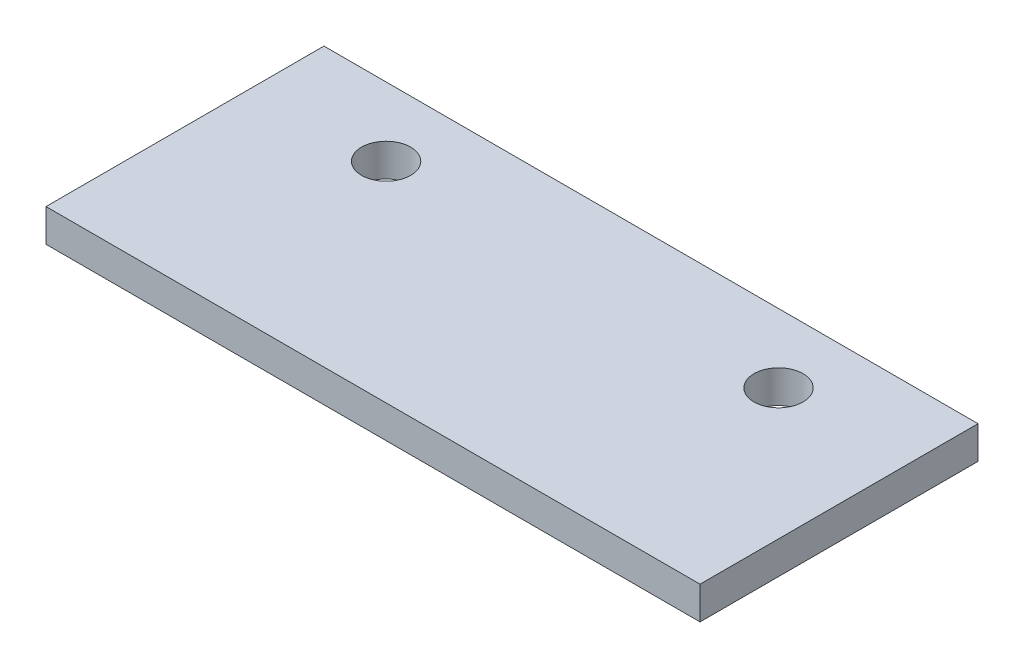
ISO-10303-21;
HEADER;
FILE_DESCRIPTION(('STEP AP214'),'2;1');
FILE_NAME('part.step','',(''),(''),'','','');
FILE_SCHEMA(('AUTOMOTIVE_DESIGN { 1 0 10303 214 1 1 1 1 }'));
ENDSEC;
DATA;
#1=APPLICATION_CONTEXT('core data for automotive mechanical design processes');
#2=APPLICATION_PROTOCOL_DEFINITION('international standard','automotive_design',2000,#1);
#3=PRODUCT_CONTEXT('',#1,'mechanical');
#4=PRODUCT('Part','Part','',(#3));
#5=PRODUCT_RELATED_PRODUCT_CATEGORY('part','',(#4));
#6=PRODUCT_DEFINITION_FORMATION('','',#4);
#7=PRODUCT_DEFINITION_CONTEXT('part definition',#1,'design');
#8=PRODUCT_DEFINITION('design','',#6,#7);
#9=PRODUCT_DEFINITION_SHAPE('','',#8);
#10=(LENGTH_UNIT() NAMED_UNIT(*) SI_UNIT(.MILLI.,.METRE.));
#11=(NAMED_UNIT(*) PLANE_ANGLE_UNIT() SI_UNIT($,.RADIAN.));
#12=(NAMED_UNIT(*) SI_UNIT($,.STERADIAN.) SOLID_ANGLE_UNIT());
#13=UNCERTAINTY_MEASURE_WITH_UNIT(LENGTH_MEASURE(1.E-05),#10,'distance_accuracy_value','');
#14=(GEOMETRIC_REPRESENTATION_CONTEXT(3) GLOBAL_UNCERTAINTY_ASSIGNED_CONTEXT((#13)) GLOBAL_UNIT_ASSIGNED_CONTEXT((#10,
#11,#12)) REPRESENTATION_CONTEXT('',''));
#15=CARTESIAN_POINT('',(0.,0.,0.));
#16=DIRECTION('',(0.,0.,1.));
#17=DIRECTION('',(1.,0.,0.));
#18=AXIS2_PLACEMENT_3D('',#15,#16,#17);
#19=CARTESIAN_POINT('',(-100.,10.,42.5));
#20=DIRECTION('',(1.,0.,0.));
#21=DIRECTION('',(0.,0.,-1.));
#22=AXIS2_PLACEMENT_3D('',#19,#20,#21);
#23=PLANE('',#22);
#24=DIRECTION('',(0.,0.,1.));
#25=VECTOR('',#24,1.);
#26=CARTESIAN_POINT('',(-100.,0.,42.5));
#27=LINE('',#26,#25);
#28=CARTESIAN_POINT('',(-100.,0.,-42.5));
#29=VERTEX_POINT('',#28);
#30=CARTESIAN_POINT('',(-100.,0.,42.5));
#31=VERTEX_POINT('',#30);
#32=EDGE_CURVE('E98',#29,#31,#27,.T.);
#33=ORIENTED_EDGE('',*,*,#32,.T.);
#34=DIRECTION('',(0.,-1.,0.));
#35=VECTOR('',#34,1.);
#36=CARTESIAN_POINT('',(-100.,10.,42.5));
#37=LINE('',#36,#35);
#38=CARTESIAN_POINT('',(-100.,10.,42.5));
#39=VERTEX_POINT('',#38);
#40=EDGE_CURVE('E11',#39,#31,#37,.T.);
#41=ORIENTED_EDGE('',*,*,#40,.F.);
#42=DIRECTION('',(0.,0.,1.));
#43=VECTOR('',#42,1.);
#44=CARTESIAN_POINT('',(-100.,10.,42.5));
#45=LINE('',#44,#43);
#46=CARTESIAN_POINT('',(-100.,10.,-42.5));
#47=VERTEX_POINT('',#46);
#48=EDGE_CURVE('E86',#47,#39,#45,.T.);
#49=ORIENTED_EDGE('',*,*,#48,.F.);
#50=DIRECTION('',(0.,-1.,0.));
#51=VECTOR('',#50,1.);
#52=CARTESIAN_POINT('',(-100.,10.,-42.5));
#53=LINE('',#52,#51);
#54=EDGE_CURVE('E94',#47,#29,#53,.T.);
#55=ORIENTED_EDGE('',*,*,#54,.T.);
#56=EDGE_LOOP('',(#33,#41,#49,#55));
#57=FACE_BOUND('',#56,.T.);
#58=ADVANCED_FACE('F35',(#57),#23,.F.);
#59=CARTESIAN_POINT('',(100.,10.,42.5));
#60=DIRECTION('',(0.,0.,-1.));
#61=DIRECTION('',(-1.,0.,0.));
#62=AXIS2_PLACEMENT_3D('',#59,#60,#61);
#63=PLANE('',#62);
#64=DIRECTION('',(1.,0.,0.));
#65=VECTOR('',#64,1.);
#66=CARTESIAN_POINT('',(100.,0.,42.5));
#67=LINE('',#66,#65);
#68=CARTESIAN_POINT('',(100.,0.,42.5));
#69=VERTEX_POINT('',#68);
#70=EDGE_CURVE('E90',#31,#69,#67,.T.);
#71=ORIENTED_EDGE('',*,*,#70,.T.);
#72=DIRECTION('',(0.,-1.,0.));
#73=VECTOR('',#72,1.);
#74=CARTESIAN_POINT('',(100.,10.,42.5));
#75=LINE('',#74,#73);
#76=CARTESIAN_POINT('',(100.,10.,42.5));
#77=VERTEX_POINT('',#76);
#78=EDGE_CURVE('E43',#77,#69,#75,.T.);
#79=ORIENTED_EDGE('',*,*,#78,.F.);
#80=DIRECTION('',(1.,0.,0.));
#81=VECTOR('',#80,1.);
#82=CARTESIAN_POINT('',(100.,10.,42.5));
#83=LINE('',#82,#81);
#84=EDGE_CURVE('E81',#39,#77,#83,.T.);
#85=ORIENTED_EDGE('',*,*,#84,.F.);
#86=ORIENTED_EDGE('',*,*,#40,.T.);
#87=EDGE_LOOP('',(#71,#79,#85,#86));
#88=FACE_BOUND('',#87,.T.);
#89=ADVANCED_FACE('F89',(#88),#63,.F.);
#90=CARTESIAN_POINT('',(100.,10.,42.5));
#91=DIRECTION('',(-1.,0.,0.));
#92=DIRECTION('',(0.,0.,1.));
#93=AXIS2_PLACEMENT_3D('',#90,#91,#92);
#94=PLANE('',#93);
#95=DIRECTION('',(0.,0.,-1.));
#96=VECTOR('',#95,1.);
#97=CARTESIAN_POINT('',(100.,0.,42.5));
#98=LINE('',#97,#96);
#99=CARTESIAN_POINT('',(100.,0.,-42.5));
#100=VERTEX_POINT('',#99);
#101=EDGE_CURVE('E68',#69,#100,#98,.T.);
#102=ORIENTED_EDGE('',*,*,#101,.T.);
#103=DIRECTION('',(0.,-1.,0.));
#104=VECTOR('',#103,1.);
#105=CARTESIAN_POINT('',(100.,10.,-42.5));
#106=LINE('',#105,#104);
#107=CARTESIAN_POINT('',(100.,10.,-42.5));
#108=VERTEX_POINT('',#107);
#109=EDGE_CURVE('E91',#108,#100,#106,.T.);
#110=ORIENTED_EDGE('',*,*,#109,.F.);
#111=DIRECTION('',(0.,0.,-1.));
#112=VECTOR('',#111,1.);
#113=CARTESIAN_POINT('',(100.,10.,42.5));
#114=LINE('',#113,#112);
#115=EDGE_CURVE('E84',#77,#108,#114,.T.);
#116=ORIENTED_EDGE('',*,*,#115,.F.);
#117=ORIENTED_EDGE('',*,*,#78,.T.);
#118=EDGE_LOOP('',(#102,#110,#116,#117));
#119=FACE_BOUND('',#118,.T.);
#120=ADVANCED_FACE('F92',(#119),#94,.F.);
#121=CARTESIAN_POINT('',(100.,10.,-42.5));
#122=DIRECTION('',(0.,0.,1.));
#123=DIRECTION('',(1.,0.,0.));
#124=AXIS2_PLACEMENT_3D('',#121,#122,#123);
#125=PLANE('',#124);
#126=DIRECTION('',(-1.,0.,0.));
#127=VECTOR('',#126,1.);
#128=CARTESIAN_POINT('',(100.,0.,-42.5));
#129=LINE('',#128,#127);
#130=EDGE_CURVE('E74',#100,#29,#129,.T.);
#131=ORIENTED_EDGE('',*,*,#130,.T.);
#132=ORIENTED_EDGE('',*,*,#54,.F.);
#133=DIRECTION('',(-1.,0.,0.));
#134=VECTOR('',#133,1.);
#135=CARTESIAN_POINT('',(100.,10.,-42.5));
#136=LINE('',#135,#134);
#137=EDGE_CURVE('E51',#108,#47,#136,.T.);
#138=ORIENTED_EDGE('',*,*,#137,.F.);
#139=ORIENTED_EDGE('',*,*,#109,.T.);
#140=EDGE_LOOP('',(#131,#132,#138,#139));
#141=FACE_BOUND('',#140,.T.);
#142=ADVANCED_FACE('F106',(#141),#125,.F.);
#143=CARTESIAN_POINT('',(0.,10.,0.));
#144=DIRECTION('',(0.,1.,0.));
#145=DIRECTION('',(0.,0.,1.));
#146=AXIS2_PLACEMENT_3D('',#143,#144,#145);
#147=PLANE('',#146);
#148=CARTESIAN_POINT('',(60.,10.,-21.5));
#149=DIRECTION('',(0.,-1.,0.));
#150=DIRECTION('',(0.,0.,1.));
#151=AXIS2_PLACEMENT_3D('',#148,#149,#150);
#152=CIRCLE('',#151,7.5);
#153=CARTESIAN_POINT('',(60.,10.,-14.));
#154=VERTEX_POINT('',#153);
#155=EDGE_CURVE('E118',#154,#154,#152,.T.);
#156=ORIENTED_EDGE('',*,*,#155,.T.);
#157=EDGE_LOOP('',(#156));
#158=FACE_BOUND('',#157,.T.);
#159=CARTESIAN_POINT('',(-60.,10.,-21.5));
#160=DIRECTION('',(0.,1.,0.));
#161=DIRECTION('',(0.,0.,1.));
#162=AXIS2_PLACEMENT_3D('',#159,#160,#161);
#163=CIRCLE('',#162,7.5);
#164=CARTESIAN_POINT('',(-60.,10.,-14.));
#165=VERTEX_POINT('',#164);
#166=EDGE_CURVE('E112',#165,#165,#163,.T.);
#167=ORIENTED_EDGE('',*,*,#166,.F.);
#168=EDGE_LOOP('',(#167));
#169=FACE_BOUND('',#168,.T.);
#170=ORIENTED_EDGE('',*,*,#48,.T.);
#171=ORIENTED_EDGE('',*,*,#84,.T.);
#172=ORIENTED_EDGE('',*,*,#115,.T.);
#173=ORIENTED_EDGE('',*,*,#137,.T.);
#174=EDGE_LOOP('',(#170,#171,#172,#173));
#175=FACE_BOUND('',#174,.T.);
#176=ADVANCED_FACE('F82',(#158,#169,#175),#147,.T.);
#177=CARTESIAN_POINT('',(0.,0.,0.));
#178=DIRECTION('',(0.,1.,0.));
#179=DIRECTION('',(0.,0.,1.));
#180=AXIS2_PLACEMENT_3D('',#177,#178,#179);
#181=PLANE('',#180);
#182=CARTESIAN_POINT('',(60.,0.,-21.5));
#183=DIRECTION('',(0.,-1.,0.));
#184=DIRECTION('',(0.,0.,1.));
#185=AXIS2_PLACEMENT_3D('',#182,#183,#184);
#186=CIRCLE('',#185,7.5);
#187=CARTESIAN_POINT('',(60.,0.,-14.));
#188=VERTEX_POINT('',#187);
#189=EDGE_CURVE('E115',#188,#188,#186,.T.);
#190=ORIENTED_EDGE('',*,*,#189,.F.);
#191=EDGE_LOOP('',(#190));
#192=FACE_BOUND('',#191,.T.);
#193=CARTESIAN_POINT('',(-60.,0.,-21.5));
#194=DIRECTION('',(0.,1.,0.));
#195=DIRECTION('',(0.,0.,1.));
#196=AXIS2_PLACEMENT_3D('',#193,#194,#195);
#197=CIRCLE('',#196,7.5);
#198=CARTESIAN_POINT('',(-60.,0.,-14.));
#199=VERTEX_POINT('',#198);
#200=EDGE_CURVE('E101',#199,#199,#197,.T.);
#201=ORIENTED_EDGE('',*,*,#200,.T.);
#202=EDGE_LOOP('',(#201));
#203=FACE_BOUND('',#202,.T.);
#204=ORIENTED_EDGE('',*,*,#32,.F.);
#205=ORIENTED_EDGE('',*,*,#130,.F.);
#206=ORIENTED_EDGE('',*,*,#101,.F.);
#207=ORIENTED_EDGE('',*,*,#70,.F.);
#208=EDGE_LOOP('',(#204,#205,#206,#207));
#209=FACE_BOUND('',#208,.T.);
#210=ADVANCED_FACE('F109',(#192,#203,#209),#181,.F.);
#211=CARTESIAN_POINT('',(-60.,0.,-21.5));
#212=DIRECTION('',(0.,1.,0.));
#213=DIRECTION('',(0.,0.,1.));
#214=AXIS2_PLACEMENT_3D('',#211,#212,#213);
#215=CYLINDRICAL_SURFACE('',#214,7.5);
#216=ORIENTED_EDGE('',*,*,#200,.F.);
#217=EDGE_LOOP('',(#216));
#218=FACE_BOUND('',#217,.T.);
#219=ORIENTED_EDGE('',*,*,#166,.T.);
#220=EDGE_LOOP('',(#219));
#221=FACE_BOUND('',#220,.T.);
#222=ADVANCED_FACE('F129',(#218,#221),#215,.F.);
#223=CARTESIAN_POINT('',(60.,0.,-21.5));
#224=DIRECTION('',(0.,1.,0.));
#225=DIRECTION('',(0.,0.,1.));
#226=AXIS2_PLACEMENT_3D('',#223,#224,#225);
#227=CYLINDRICAL_SURFACE('',#226,7.5);
#228=ORIENTED_EDGE('',*,*,#189,.T.);
#229=EDGE_LOOP('',(#228));
#230=FACE_BOUND('',#229,.T.);
#231=ORIENTED_EDGE('',*,*,#155,.F.);
#232=EDGE_LOOP('',(#231));
#233=FACE_BOUND('',#232,.T.);
#234=ADVANCED_FACE('F124',(#230,#233),#227,.F.);
#235=CLOSED_SHELL('',(#58,#89,#120,#142,#176,#210,#222,#234));
#236=MANIFOLD_SOLID_BREP('B2',#235);
#237=ADVANCED_BREP_SHAPE_REPRESENTATION('',(#18,#236),#14);
#238=SHAPE_DEFINITION_REPRESENTATION(#9,#237);
ENDSEC;
END-ISO-10303-21;
